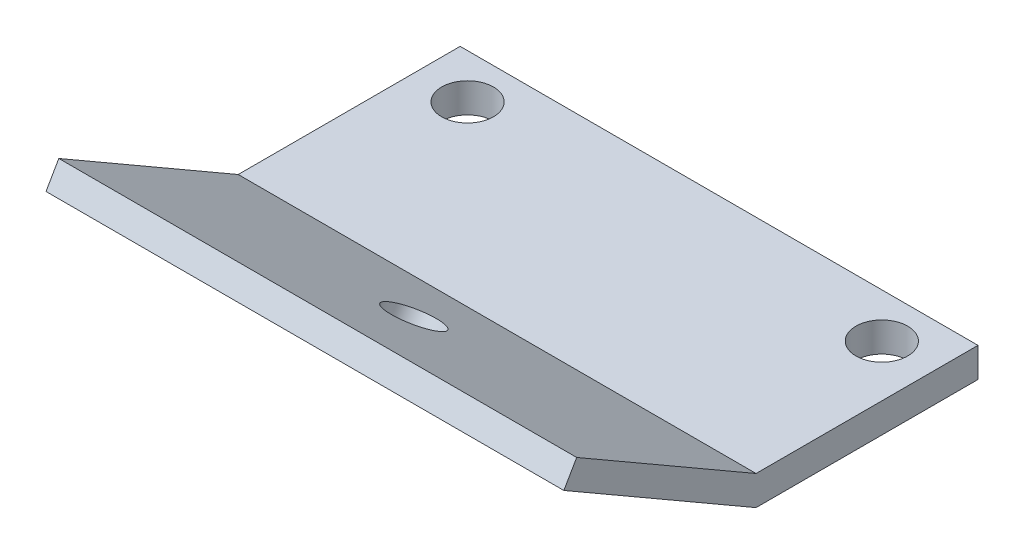
ISO-10303-21;
HEADER;
FILE_DESCRIPTION(('STEP AP214'),'2;1');
FILE_NAME('part.step','',(''),(''),'','','');
FILE_SCHEMA(('AUTOMOTIVE_DESIGN { 1 0 10303 214 1 1 1 1 }'));
ENDSEC;
DATA;
#1=APPLICATION_CONTEXT('core data for automotive mechanical design processes');
#2=APPLICATION_PROTOCOL_DEFINITION('international standard','automotive_design',2000,#1);
#3=PRODUCT_CONTEXT('',#1,'mechanical');
#4=PRODUCT('Part','Part','',(#3));
#5=PRODUCT_RELATED_PRODUCT_CATEGORY('part','',(#4));
#6=PRODUCT_DEFINITION_FORMATION('','',#4);
#7=PRODUCT_DEFINITION_CONTEXT('part definition',#1,'design');
#8=PRODUCT_DEFINITION('design','',#6,#7);
#9=PRODUCT_DEFINITION_SHAPE('','',#8);
#10=(LENGTH_UNIT() NAMED_UNIT(*) SI_UNIT(.MILLI.,.METRE.));
#11=(NAMED_UNIT(*) PLANE_ANGLE_UNIT() SI_UNIT($,.RADIAN.));
#12=(NAMED_UNIT(*) SI_UNIT($,.STERADIAN.) SOLID_ANGLE_UNIT());
#13=UNCERTAINTY_MEASURE_WITH_UNIT(LENGTH_MEASURE(1.E-05),#10,'distance_accuracy_value','');
#14=(GEOMETRIC_REPRESENTATION_CONTEXT(3) GLOBAL_UNCERTAINTY_ASSIGNED_CONTEXT((#13)) GLOBAL_UNIT_ASSIGNED_CONTEXT((#10,
#11,#12)) REPRESENTATION_CONTEXT('',''));
#15=CARTESIAN_POINT('',(0.,0.,0.));
#16=DIRECTION('',(0.,0.,1.));
#17=DIRECTION('',(1.,0.,0.));
#18=AXIS2_PLACEMENT_3D('',#15,#16,#17);
#19=CARTESIAN_POINT('',(17.5,2.,7.5));
#20=DIRECTION('',(-1.,0.,0.));
#21=DIRECTION('',(0.,0.,1.));
#22=AXIS2_PLACEMENT_3D('',#19,#20,#21);
#23=PLANE('',#22);
#24=DIRECTION('',(0.,0.,-1.));
#25=VECTOR('',#24,1.);
#26=CARTESIAN_POINT('',(17.5,2.,7.5));
#27=LINE('',#26,#25);
#28=CARTESIAN_POINT('',(17.5,2.,7.5));
#29=VERTEX_POINT('',#28);
#30=CARTESIAN_POINT('',(17.5,2.,-7.5));
#31=VERTEX_POINT('',#30);
#32=EDGE_CURVE('E130',#29,#31,#27,.T.);
#33=ORIENTED_EDGE('',*,*,#32,.F.);
#34=DIRECTION('',(0.,-0.500000000000001,-0.866025403784438));
#35=VECTOR('',#34,1.);
#36=CARTESIAN_POINT('',(17.5,9.00000000000001,19.6243556529821));
#37=LINE('',#36,#35);
#38=CARTESIAN_POINT('',(17.5,9.00000000000001,19.6243556529821));
#39=VERTEX_POINT('',#38);
#40=EDGE_CURVE('E117',#39,#29,#37,.T.);
#41=ORIENTED_EDGE('',*,*,#40,.F.);
#42=DIRECTION('',(0.,0.866025403784438,-0.500000000000001));
#43=VECTOR('',#42,1.);
#44=CARTESIAN_POINT('',(17.5,7.50000000000001,20.4903810567666));
#45=LINE('',#44,#43);
#46=CARTESIAN_POINT('',(17.5,7.50000000000001,20.4903810567666));
#47=VERTEX_POINT('',#46);
#48=EDGE_CURVE('E100',#47,#39,#45,.T.);
#49=ORIENTED_EDGE('',*,*,#48,.F.);
#50=DIRECTION('',(0.,-0.500000000000001,-0.866025403784438));
#51=VECTOR('',#50,1.);
#52=CARTESIAN_POINT('',(17.5,7.50000000000001,20.4903810567666));
#53=LINE('',#52,#51);
#54=CARTESIAN_POINT('',(17.5,0.,7.5));
#55=VERTEX_POINT('',#54);
#56=EDGE_CURVE('E97',#47,#55,#53,.T.);
#57=ORIENTED_EDGE('',*,*,#56,.T.);
#58=DIRECTION('',(0.,0.,-1.));
#59=VECTOR('',#58,1.);
#60=CARTESIAN_POINT('',(17.5,0.,7.5));
#61=LINE('',#60,#59);
#62=CARTESIAN_POINT('',(17.5,0.,-7.5));
#63=VERTEX_POINT('',#62);
#64=EDGE_CURVE('E127',#55,#63,#61,.T.);
#65=ORIENTED_EDGE('',*,*,#64,.T.);
#66=DIRECTION('',(0.,-1.,0.));
#67=VECTOR('',#66,1.);
#68=CARTESIAN_POINT('',(17.5,2.,-7.5));
#69=LINE('',#68,#67);
#70=EDGE_CURVE('E11',#31,#63,#69,.T.);
#71=ORIENTED_EDGE('',*,*,#70,.F.);
#72=EDGE_LOOP('',(#33,#41,#49,#57,#65,#71));
#73=FACE_BOUND('',#72,.T.);
#74=ADVANCED_FACE('F32',(#73),#23,.F.);
#75=CARTESIAN_POINT('',(-17.5,2.,-7.5));
#76=DIRECTION('',(0.,0.,1.));
#77=DIRECTION('',(1.,0.,0.));
#78=AXIS2_PLACEMENT_3D('',#75,#76,#77);
#79=PLANE('',#78);
#80=DIRECTION('',(-1.,0.,0.));
#81=VECTOR('',#80,1.);
#82=CARTESIAN_POINT('',(-17.5,0.,-7.5));
#83=LINE('',#82,#81);
#84=CARTESIAN_POINT('',(-17.5,0.,-7.5));
#85=VERTEX_POINT('',#84);
#86=EDGE_CURVE('E61',#63,#85,#83,.T.);
#87=ORIENTED_EDGE('',*,*,#86,.T.);
#88=DIRECTION('',(0.,-1.,0.));
#89=VECTOR('',#88,1.);
#90=CARTESIAN_POINT('',(-17.5,2.,-7.5));
#91=LINE('',#90,#89);
#92=CARTESIAN_POINT('',(-17.5,2.,-7.5));
#93=VERTEX_POINT('',#92);
#94=EDGE_CURVE('E40',#93,#85,#91,.T.);
#95=ORIENTED_EDGE('',*,*,#94,.F.);
#96=DIRECTION('',(-1.,0.,0.));
#97=VECTOR('',#96,1.);
#98=CARTESIAN_POINT('',(-17.5,2.,-7.5));
#99=LINE('',#98,#97);
#100=EDGE_CURVE('E73',#31,#93,#99,.T.);
#101=ORIENTED_EDGE('',*,*,#100,.F.);
#102=ORIENTED_EDGE('',*,*,#70,.T.);
#103=EDGE_LOOP('',(#87,#95,#101,#102));
#104=FACE_BOUND('',#103,.T.);
#105=ADVANCED_FACE('F170',(#104),#79,.F.);
#106=CARTESIAN_POINT('',(-17.5,2.,7.5));
#107=DIRECTION('',(1.,0.,0.));
#108=DIRECTION('',(0.,0.,-1.));
#109=AXIS2_PLACEMENT_3D('',#106,#107,#108);
#110=PLANE('',#109);
#111=DIRECTION('',(0.,-0.500000000000001,-0.866025403784438));
#112=VECTOR('',#111,1.);
#113=CARTESIAN_POINT('',(-17.5,9.00000000000001,19.6243556529821));
#114=LINE('',#113,#112);
#115=CARTESIAN_POINT('',(-17.5,9.00000000000001,19.6243556529821));
#116=VERTEX_POINT('',#115);
#117=CARTESIAN_POINT('',(-17.5,2.,7.5));
#118=VERTEX_POINT('',#117);
#119=EDGE_CURVE('E149',#116,#118,#114,.T.);
#120=ORIENTED_EDGE('',*,*,#119,.T.);
#121=DIRECTION('',(0.,0.,1.));
#122=VECTOR('',#121,1.);
#123=CARTESIAN_POINT('',(-17.5,2.,7.5));
#124=LINE('',#123,#122);
#125=EDGE_CURVE('E134',#93,#118,#124,.T.);
#126=ORIENTED_EDGE('',*,*,#125,.F.);
#127=ORIENTED_EDGE('',*,*,#94,.T.);
#128=DIRECTION('',(0.,0.,1.));
#129=VECTOR('',#128,1.);
#130=CARTESIAN_POINT('',(-17.5,0.,7.5));
#131=LINE('',#130,#129);
#132=CARTESIAN_POINT('',(-17.5,0.,7.5));
#133=VERTEX_POINT('',#132);
#134=EDGE_CURVE('E68',#85,#133,#131,.T.);
#135=ORIENTED_EDGE('',*,*,#134,.T.);
#136=DIRECTION('',(0.,-0.500000000000001,-0.866025403784438));
#137=VECTOR('',#136,1.);
#138=CARTESIAN_POINT('',(-17.5,7.50000000000001,20.4903810567666));
#139=LINE('',#138,#137);
#140=CARTESIAN_POINT('',(-17.5,7.50000000000001,20.4903810567666));
#141=VERTEX_POINT('',#140);
#142=EDGE_CURVE('E95',#141,#133,#139,.T.);
#143=ORIENTED_EDGE('',*,*,#142,.F.);
#144=DIRECTION('',(0.,-0.866025403784438,0.500000000000001));
#145=VECTOR('',#144,1.);
#146=CARTESIAN_POINT('',(-17.5,7.50000000000001,20.4903810567666));
#147=LINE('',#146,#145);
#148=EDGE_CURVE('E101',#116,#141,#147,.T.);
#149=ORIENTED_EDGE('',*,*,#148,.F.);
#150=EDGE_LOOP('',(#120,#126,#127,#135,#143,#149));
#151=FACE_BOUND('',#150,.T.);
#152=ADVANCED_FACE('F111',(#151),#110,.F.);
#153=CARTESIAN_POINT('',(0.,2.,0.));
#154=DIRECTION('',(0.,-1.,0.));
#155=DIRECTION('',(0.,0.,-1.));
#156=AXIS2_PLACEMENT_3D('',#153,#154,#155);
#157=PLANE('',#156);
#158=CARTESIAN_POINT('',(14.,2.,-4.49999999999995));
#159=DIRECTION('',(0.,1.,0.));
#160=DIRECTION('',(0.,0.,1.));
#161=AXIS2_PLACEMENT_3D('',#158,#159,#160);
#162=CIRCLE('',#161,1.75);
#163=CARTESIAN_POINT('',(14.,2.,-2.74999999999995));
#164=VERTEX_POINT('',#163);
#165=EDGE_CURVE('E112',#164,#164,#162,.T.);
#166=ORIENTED_EDGE('',*,*,#165,.F.);
#167=EDGE_LOOP('',(#166));
#168=FACE_BOUND('',#167,.T.);
#169=CARTESIAN_POINT('',(-14.,2.,-4.49999999999995));
#170=DIRECTION('',(0.,1.,0.));
#171=DIRECTION('',(0.,0.,1.));
#172=AXIS2_PLACEMENT_3D('',#169,#170,#171);
#173=CIRCLE('',#172,1.75);
#174=CARTESIAN_POINT('',(-14.,2.,-2.74999999999995));
#175=VERTEX_POINT('',#174);
#176=EDGE_CURVE('E122',#175,#175,#173,.T.);
#177=ORIENTED_EDGE('',*,*,#176,.F.);
#178=EDGE_LOOP('',(#177));
#179=FACE_BOUND('',#178,.T.);
#180=ORIENTED_EDGE('',*,*,#32,.T.);
#181=ORIENTED_EDGE('',*,*,#100,.T.);
#182=ORIENTED_EDGE('',*,*,#125,.T.);
#183=DIRECTION('',(1.,0.,0.));
#184=VECTOR('',#183,1.);
#185=CARTESIAN_POINT('',(-17.5,2.,7.5));
#186=LINE('',#185,#184);
#187=EDGE_CURVE('E48',#118,#29,#186,.T.);
#188=ORIENTED_EDGE('',*,*,#187,.T.);
#189=EDGE_LOOP('',(#180,#181,#182,#188));
#190=FACE_BOUND('',#189,.T.);
#191=ADVANCED_FACE('F177',(#168,#179,#190),#157,.F.);
#192=CARTESIAN_POINT('',(0.,0.,0.));
#193=DIRECTION('',(0.,-1.,0.));
#194=DIRECTION('',(0.,0.,-1.));
#195=AXIS2_PLACEMENT_3D('',#192,#193,#194);
#196=PLANE('',#195);
#197=CARTESIAN_POINT('',(14.,0.,-4.49999999999995));
#198=DIRECTION('',(0.,1.,0.));
#199=DIRECTION('',(0.,0.,1.));
#200=AXIS2_PLACEMENT_3D('',#197,#198,#199);
#201=CIRCLE('',#200,1.75);
#202=CARTESIAN_POINT('',(14.,0.,-2.74999999999995));
#203=VERTEX_POINT('',#202);
#204=EDGE_CURVE('E115',#203,#203,#201,.T.);
#205=ORIENTED_EDGE('',*,*,#204,.T.);
#206=EDGE_LOOP('',(#205));
#207=FACE_BOUND('',#206,.T.);
#208=CARTESIAN_POINT('',(-14.,0.,-4.49999999999995));
#209=DIRECTION('',(0.,1.,0.));
#210=DIRECTION('',(0.,0.,1.));
#211=AXIS2_PLACEMENT_3D('',#208,#209,#210);
#212=CIRCLE('',#211,1.75);
#213=CARTESIAN_POINT('',(-14.,0.,-2.74999999999995));
#214=VERTEX_POINT('',#213);
#215=EDGE_CURVE('E124',#214,#214,#212,.T.);
#216=ORIENTED_EDGE('',*,*,#215,.T.);
#217=EDGE_LOOP('',(#216));
#218=FACE_BOUND('',#217,.T.);
#219=ORIENTED_EDGE('',*,*,#64,.F.);
#220=DIRECTION('',(1.,0.,0.));
#221=VECTOR('',#220,1.);
#222=CARTESIAN_POINT('',(-17.5,0.,7.5));
#223=LINE('',#222,#221);
#224=EDGE_CURVE('E132',#133,#55,#223,.T.);
#225=ORIENTED_EDGE('',*,*,#224,.F.);
#226=ORIENTED_EDGE('',*,*,#134,.F.);
#227=ORIENTED_EDGE('',*,*,#86,.F.);
#228=EDGE_LOOP('',(#219,#225,#226,#227));
#229=FACE_BOUND('',#228,.T.);
#230=ADVANCED_FACE('F143',(#207,#218,#229),#196,.T.);
#231=CARTESIAN_POINT('',(-14.,0.,-4.49999999999995));
#232=DIRECTION('',(0.,1.,0.));
#233=DIRECTION('',(0.,0.,1.));
#234=AXIS2_PLACEMENT_3D('',#231,#232,#233);
#235=CYLINDRICAL_SURFACE('',#234,1.75);
#236=ORIENTED_EDGE('',*,*,#215,.F.);
#237=EDGE_LOOP('',(#236));
#238=FACE_BOUND('',#237,.T.);
#239=ORIENTED_EDGE('',*,*,#176,.T.);
#240=EDGE_LOOP('',(#239));
#241=FACE_BOUND('',#240,.T.);
#242=ADVANCED_FACE('F164',(#238,#241),#235,.F.);
#243=CARTESIAN_POINT('',(14.,0.,-4.49999999999995));
#244=DIRECTION('',(0.,1.,0.));
#245=DIRECTION('',(0.,0.,1.));
#246=AXIS2_PLACEMENT_3D('',#243,#244,#245);
#247=CYLINDRICAL_SURFACE('',#246,1.75);
#248=ORIENTED_EDGE('',*,*,#204,.F.);
#249=EDGE_LOOP('',(#248));
#250=FACE_BOUND('',#249,.T.);
#251=ORIENTED_EDGE('',*,*,#165,.T.);
#252=EDGE_LOOP('',(#251));
#253=FACE_BOUND('',#252,.T.);
#254=ADVANCED_FACE('F155',(#250,#253),#247,.F.);
#255=CARTESIAN_POINT('',(-17.5,9.00000000000001,19.6243556529821));
#256=DIRECTION('',(0.,-0.866025403784438,0.500000000000001));
#257=DIRECTION('',(0.,-0.500000000000001,-0.866025403784438));
#258=AXIS2_PLACEMENT_3D('',#255,#256,#257);
#259=PLANE('',#258);
#260=CARTESIAN_POINT('',(0.,5.25,13.1291651245988));
#261=DIRECTION('',(0.,-0.866025403784438,0.500000000000001));
#262=DIRECTION('',(0.,-0.500000000000001,-0.866025403784438));
#263=AXIS2_PLACEMENT_3D('',#260,#261,#262);
#264=CIRCLE('',#263,1.75);
#265=CARTESIAN_POINT('',(0.,4.375,11.6136206679761));
#266=VERTEX_POINT('',#265);
#267=EDGE_CURVE('E109',#266,#266,#264,.F.);
#268=ORIENTED_EDGE('',*,*,#267,.F.);
#269=EDGE_LOOP('',(#268));
#270=FACE_BOUND('',#269,.T.);
#271=ORIENTED_EDGE('',*,*,#40,.T.);
#272=ORIENTED_EDGE('',*,*,#187,.F.);
#273=ORIENTED_EDGE('',*,*,#119,.F.);
#274=DIRECTION('',(-1.,0.,0.));
#275=VECTOR('',#274,1.);
#276=CARTESIAN_POINT('',(-17.5,9.00000000000001,19.6243556529821));
#277=LINE('',#276,#275);
#278=EDGE_CURVE('E106',#39,#116,#277,.T.);
#279=ORIENTED_EDGE('',*,*,#278,.F.);
#280=EDGE_LOOP('',(#271,#272,#273,#279));
#281=FACE_BOUND('',#280,.T.);
#282=ADVANCED_FACE('F153',(#270,#281),#259,.F.);
#283=CARTESIAN_POINT('',(-17.5,7.50000000000001,20.4903810567666));
#284=DIRECTION('',(0.,0.866025403784438,-0.500000000000001));
#285=DIRECTION('',(0.,0.500000000000001,0.866025403784438));
#286=AXIS2_PLACEMENT_3D('',#283,#284,#285);
#287=PLANE('',#286);
#288=CARTESIAN_POINT('',(0.,3.75000000000001,13.9951905283833));
#289=DIRECTION('',(0.,-0.866025403784438,0.500000000000001));
#290=DIRECTION('',(0.,-0.500000000000001,-0.866025403784438));
#291=AXIS2_PLACEMENT_3D('',#288,#289,#290);
#292=CIRCLE('',#291,1.75);
#293=CARTESIAN_POINT('',(0.,2.87500000000001,12.4796460717605));
#294=VERTEX_POINT('',#293);
#295=EDGE_CURVE('E257',#294,#294,#292,.T.);
#296=ORIENTED_EDGE('',*,*,#295,.F.);
#297=EDGE_LOOP('',(#296));
#298=FACE_BOUND('',#297,.T.);
#299=ORIENTED_EDGE('',*,*,#224,.T.);
#300=ORIENTED_EDGE('',*,*,#56,.F.);
#301=DIRECTION('',(1.,0.,0.));
#302=VECTOR('',#301,1.);
#303=CARTESIAN_POINT('',(-17.5,7.50000000000001,20.4903810567666));
#304=LINE('',#303,#302);
#305=EDGE_CURVE('E91',#141,#47,#304,.T.);
#306=ORIENTED_EDGE('',*,*,#305,.F.);
#307=ORIENTED_EDGE('',*,*,#142,.T.);
#308=EDGE_LOOP('',(#299,#300,#306,#307));
#309=FACE_BOUND('',#308,.T.);
#310=ADVANCED_FACE('F94',(#298,#309),#287,.F.);
#311=CARTESIAN_POINT('',(0.,10.7475952641917,18.6153810567666));
#312=DIRECTION('',(0.,-0.500000000000001,-0.866025403784438));
#313=DIRECTION('',(0.,0.866025403784438,-0.500000000000001));
#314=AXIS2_PLACEMENT_3D('',#311,#312,#313);
#315=PLANE('',#314);
#316=ORIENTED_EDGE('',*,*,#148,.T.);
#317=ORIENTED_EDGE('',*,*,#305,.T.);
#318=ORIENTED_EDGE('',*,*,#48,.T.);
#319=ORIENTED_EDGE('',*,*,#278,.T.);
#320=EDGE_LOOP('',(#316,#317,#318,#319));
#321=FACE_BOUND('',#320,.T.);
#322=ADVANCED_FACE('F104',(#321),#315,.F.);
#323=CARTESIAN_POINT('',(0.,16.9963735410852,6.34739319865139));
#324=DIRECTION('',(0.,-0.866025403784438,0.500000000000001));
#325=DIRECTION('',(0.,-0.500000000000001,-0.866025403784438));
#326=AXIS2_PLACEMENT_3D('',#323,#324,#325);
#327=CYLINDRICAL_SURFACE('',#326,1.75);
#328=ORIENTED_EDGE('',*,*,#295,.T.);
#329=EDGE_LOOP('',(#328));
#330=FACE_BOUND('',#329,.T.);
#331=ORIENTED_EDGE('',*,*,#267,.T.);
#332=EDGE_LOOP('',(#331));
#333=FACE_BOUND('',#332,.T.);
#334=ADVANCED_FACE('F232',(#330,#333),#327,.F.);
#335=CLOSED_SHELL('',(#74,#105,#152,#191,#230,#242,#254,#282,#310,#322,#334));
#336=MANIFOLD_SOLID_BREP('B2',#335);
#337=ADVANCED_BREP_SHAPE_REPRESENTATION('',(#18,#336),#14);
#338=SHAPE_DEFINITION_REPRESENTATION(#9,#337);
ENDSEC;
END-ISO-10303-21;
